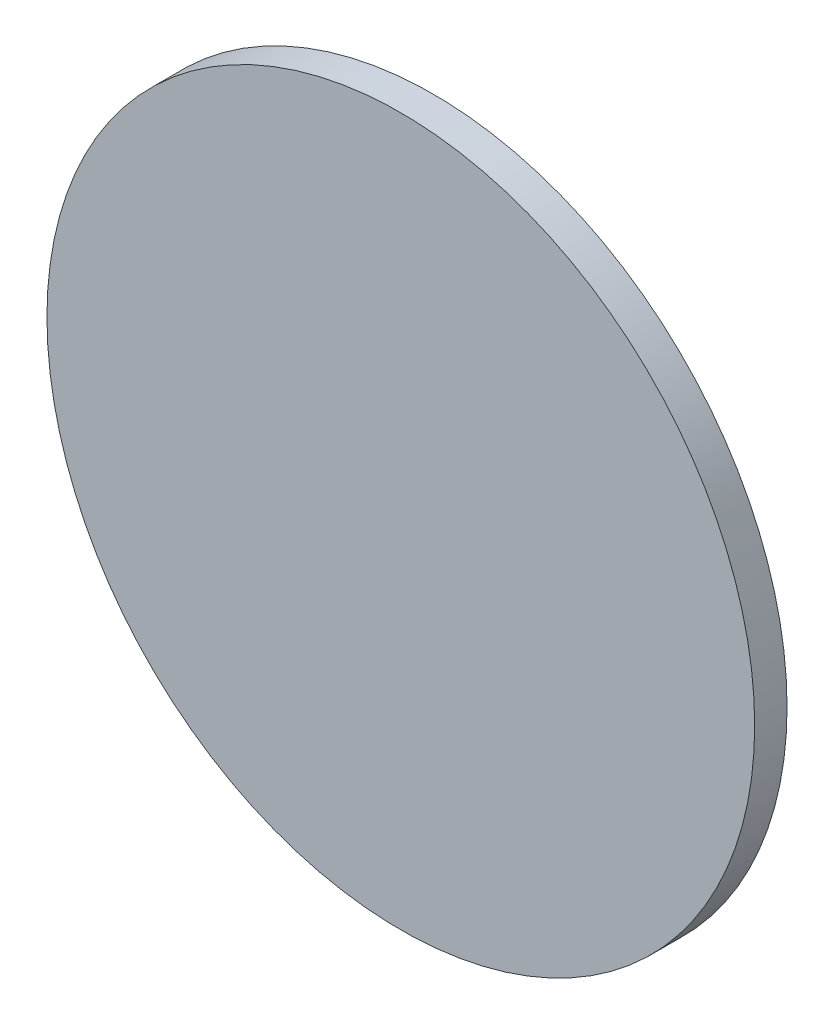
ISO-10303-21;
HEADER;
FILE_DESCRIPTION(('STEP AP214'),'2;1');
FILE_NAME('part.step','',(''),(''),'','','');
FILE_SCHEMA(('AUTOMOTIVE_DESIGN { 1 0 10303 214 1 1 1 1 }'));
ENDSEC;
DATA;
#1=APPLICATION_CONTEXT('core data for automotive mechanical design processes');
#2=APPLICATION_PROTOCOL_DEFINITION('international standard','automotive_design',2000,#1);
#3=PRODUCT_CONTEXT('',#1,'mechanical');
#4=PRODUCT('Part','Part','',(#3));
#5=PRODUCT_RELATED_PRODUCT_CATEGORY('part','',(#4));
#6=PRODUCT_DEFINITION_FORMATION('','',#4);
#7=PRODUCT_DEFINITION_CONTEXT('part definition',#1,'design');
#8=PRODUCT_DEFINITION('design','',#6,#7);
#9=PRODUCT_DEFINITION_SHAPE('','',#8);
#10=(LENGTH_UNIT() NAMED_UNIT(*) SI_UNIT(.MILLI.,.METRE.));
#11=(NAMED_UNIT(*) PLANE_ANGLE_UNIT() SI_UNIT($,.RADIAN.));
#12=(NAMED_UNIT(*) SI_UNIT($,.STERADIAN.) SOLID_ANGLE_UNIT());
#13=UNCERTAINTY_MEASURE_WITH_UNIT(LENGTH_MEASURE(1.E-05),#10,'distance_accuracy_value','');
#14=(GEOMETRIC_REPRESENTATION_CONTEXT(3) GLOBAL_UNCERTAINTY_ASSIGNED_CONTEXT((#13)) GLOBAL_UNIT_ASSIGNED_CONTEXT((#10,
#11,#12)) REPRESENTATION_CONTEXT('',''));
#15=CARTESIAN_POINT('',(0.,0.,0.));
#16=DIRECTION('',(0.,0.,1.));
#17=DIRECTION('',(1.,0.,0.));
#18=AXIS2_PLACEMENT_3D('',#15,#16,#17);
#19=CARTESIAN_POINT('',(0.,0.,-932.));
#20=DIRECTION('',(0.,0.,1.));
#21=DIRECTION('',(1.,0.,0.));
#22=AXIS2_PLACEMENT_3D('',#19,#20,#21);
#23=CYLINDRICAL_SURFACE('',#22,17.5);
#24=CARTESIAN_POINT('',(0.,0.,-932.));
#25=DIRECTION('',(0.,0.,-1.));
#26=DIRECTION('',(-1.,0.,0.));
#27=AXIS2_PLACEMENT_3D('',#24,#25,#26);
#28=CIRCLE('',#27,17.5);
#29=CARTESIAN_POINT('',(-17.5,0.,-932.));
#30=VERTEX_POINT('',#29);
#31=EDGE_CURVE('E10',#30,#30,#28,.T.);
#32=ORIENTED_EDGE('',*,*,#31,.F.);
#33=EDGE_LOOP('',(#32));
#34=FACE_BOUND('',#33,.T.);
#35=CARTESIAN_POINT('',(0.,0.,-930.4));
#36=DIRECTION('',(0.,0.,-1.));
#37=DIRECTION('',(-1.,0.,0.));
#38=AXIS2_PLACEMENT_3D('',#35,#36,#37);
#39=CIRCLE('',#38,17.5);
#40=CARTESIAN_POINT('',(-17.5,0.,-930.4));
#41=VERTEX_POINT('',#40);
#42=EDGE_CURVE('E36',#41,#41,#39,.T.);
#43=ORIENTED_EDGE('',*,*,#42,.T.);
#44=EDGE_LOOP('',(#43));
#45=FACE_BOUND('',#44,.T.);
#46=ADVANCED_FACE('F33',(#34,#45),#23,.T.);
#47=CARTESIAN_POINT('',(0.,0.,-932.));
#48=DIRECTION('',(0.,0.,-1.));
#49=DIRECTION('',(-1.,0.,0.));
#50=AXIS2_PLACEMENT_3D('',#47,#48,#49);
#51=PLANE('',#50);
#52=ORIENTED_EDGE('',*,*,#31,.T.);
#53=EDGE_LOOP('',(#52));
#54=FACE_BOUND('',#53,.T.);
#55=ADVANCED_FACE('F48',(#54),#51,.T.);
#56=CARTESIAN_POINT('',(0.,0.,-930.4));
#57=DIRECTION('',(0.,0.,-1.));
#58=DIRECTION('',(-1.,0.,0.));
#59=AXIS2_PLACEMENT_3D('',#56,#57,#58);
#60=PLANE('',#59);
#61=ORIENTED_EDGE('',*,*,#42,.F.);
#62=EDGE_LOOP('',(#61));
#63=FACE_BOUND('',#62,.T.);
#64=ADVANCED_FACE('F46',(#63),#60,.F.);
#65=CLOSED_SHELL('',(#46,#55,#64));
#66=MANIFOLD_SOLID_BREP('B2',#65);
#67=ADVANCED_BREP_SHAPE_REPRESENTATION('',(#18,#66),#14);
#68=SHAPE_DEFINITION_REPRESENTATION(#9,#67);
ENDSEC;
END-ISO-10303-21;
